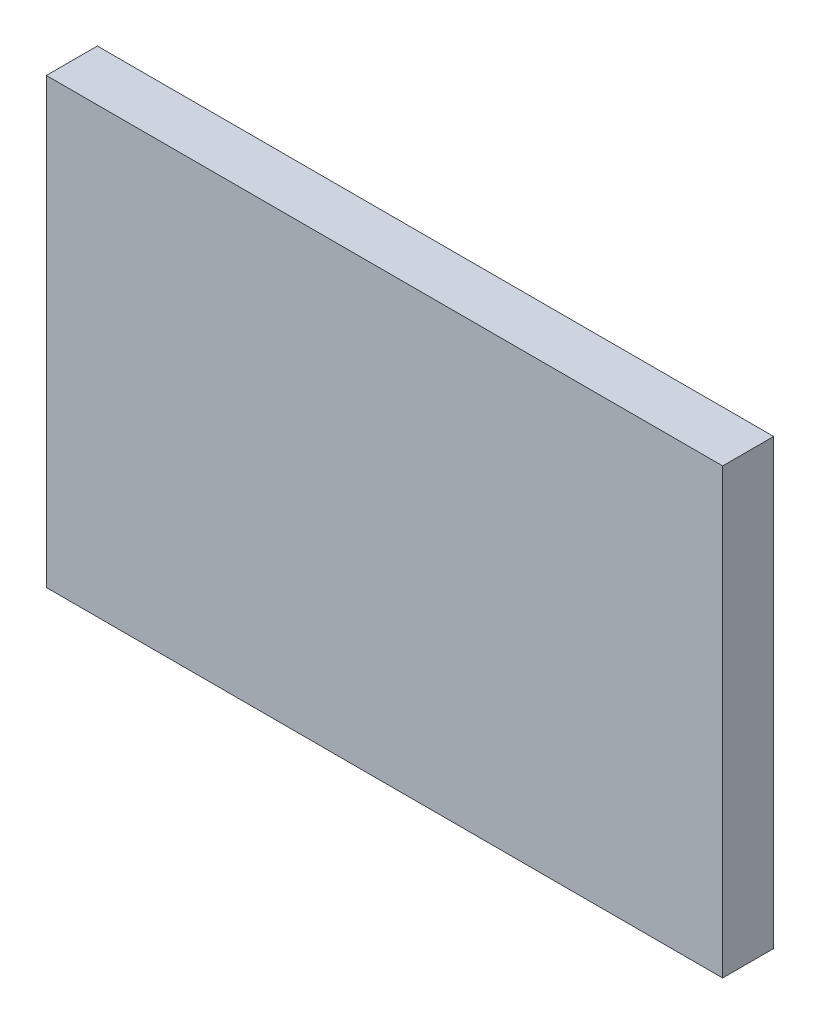
ISO-10303-21;
HEADER;
FILE_DESCRIPTION(('STEP AP214'),'2;1');
FILE_NAME('part.step','',(''),(''),'','','');
FILE_SCHEMA(('AUTOMOTIVE_DESIGN { 1 0 10303 214 1 1 1 1 }'));
ENDSEC;
DATA;
#1=APPLICATION_CONTEXT('core data for automotive mechanical design processes');
#2=APPLICATION_PROTOCOL_DEFINITION('international standard','automotive_design',2000,#1);
#3=PRODUCT_CONTEXT('',#1,'mechanical');
#4=PRODUCT('Part','Part','',(#3));
#5=PRODUCT_RELATED_PRODUCT_CATEGORY('part','',(#4));
#6=PRODUCT_DEFINITION_FORMATION('','',#4);
#7=PRODUCT_DEFINITION_CONTEXT('part definition',#1,'design');
#8=PRODUCT_DEFINITION('design','',#6,#7);
#9=PRODUCT_DEFINITION_SHAPE('','',#8);
#10=(LENGTH_UNIT() NAMED_UNIT(*) SI_UNIT(.MILLI.,.METRE.));
#11=(NAMED_UNIT(*) PLANE_ANGLE_UNIT() SI_UNIT($,.RADIAN.));
#12=(NAMED_UNIT(*) SI_UNIT($,.STERADIAN.) SOLID_ANGLE_UNIT());
#13=UNCERTAINTY_MEASURE_WITH_UNIT(LENGTH_MEASURE(1.E-05),#10,'distance_accuracy_value','');
#14=(GEOMETRIC_REPRESENTATION_CONTEXT(3) GLOBAL_UNCERTAINTY_ASSIGNED_CONTEXT((#13)) GLOBAL_UNIT_ASSIGNED_CONTEXT((#10,
#11,#12)) REPRESENTATION_CONTEXT('',''));
#15=CARTESIAN_POINT('',(0.,0.,0.));
#16=DIRECTION('',(0.,0.,1.));
#17=DIRECTION('',(1.,0.,0.));
#18=AXIS2_PLACEMENT_3D('',#15,#16,#17);
#19=CARTESIAN_POINT('',(0.,0.,-2.921));
#20=DIRECTION('',(-1.,0.,0.));
#21=DIRECTION('',(0.,0.,1.));
#22=AXIS2_PLACEMENT_3D('',#19,#20,#21);
#23=PLANE('',#22);
#24=DIRECTION('',(0.,-1.,0.));
#25=VECTOR('',#24,1.);
#26=CARTESIAN_POINT('',(0.,0.,0.));
#27=LINE('',#26,#25);
#28=CARTESIAN_POINT('',(0.,25.4,0.));
#29=VERTEX_POINT('',#28);
#30=CARTESIAN_POINT('',(0.,0.,0.));
#31=VERTEX_POINT('',#30);
#32=EDGE_CURVE('E100',#29,#31,#27,.T.);
#33=ORIENTED_EDGE('',*,*,#32,.F.);
#34=DIRECTION('',(0.,0.,1.));
#35=VECTOR('',#34,1.);
#36=CARTESIAN_POINT('',(0.,25.4,-2.921));
#37=LINE('',#36,#35);
#38=CARTESIAN_POINT('',(0.,25.4,-2.921));
#39=VERTEX_POINT('',#38);
#40=EDGE_CURVE('E11',#39,#29,#37,.T.);
#41=ORIENTED_EDGE('',*,*,#40,.F.);
#42=DIRECTION('',(0.,-1.,0.));
#43=VECTOR('',#42,1.);
#44=CARTESIAN_POINT('',(0.,0.,-2.921));
#45=LINE('',#44,#43);
#46=CARTESIAN_POINT('',(0.,0.,-2.921));
#47=VERTEX_POINT('',#46);
#48=EDGE_CURVE('E94',#39,#47,#45,.T.);
#49=ORIENTED_EDGE('',*,*,#48,.T.);
#50=DIRECTION('',(0.,0.,1.));
#51=VECTOR('',#50,1.);
#52=CARTESIAN_POINT('',(0.,0.,-2.921));
#53=LINE('',#52,#51);
#54=EDGE_CURVE('E39',#47,#31,#53,.T.);
#55=ORIENTED_EDGE('',*,*,#54,.T.);
#56=EDGE_LOOP('',(#33,#41,#49,#55));
#57=FACE_BOUND('',#56,.T.);
#58=ADVANCED_FACE('F36',(#57),#23,.T.);
#59=CARTESIAN_POINT('',(0.,25.4,-2.921));
#60=DIRECTION('',(0.,1.,0.));
#61=DIRECTION('',(0.,0.,1.));
#62=AXIS2_PLACEMENT_3D('',#59,#60,#61);
#63=PLANE('',#62);
#64=DIRECTION('',(-1.,0.,0.));
#65=VECTOR('',#64,1.);
#66=CARTESIAN_POINT('',(0.,25.4,0.));
#67=LINE('',#66,#65);
#68=CARTESIAN_POINT('',(38.735,25.4,0.));
#69=VERTEX_POINT('',#68);
#70=EDGE_CURVE('E96',#69,#29,#67,.T.);
#71=ORIENTED_EDGE('',*,*,#70,.F.);
#72=DIRECTION('',(0.,0.,1.));
#73=VECTOR('',#72,1.);
#74=CARTESIAN_POINT('',(38.735,25.4,-2.921));
#75=LINE('',#74,#73);
#76=CARTESIAN_POINT('',(38.735,25.4,-2.921));
#77=VERTEX_POINT('',#76);
#78=EDGE_CURVE('E45',#77,#69,#75,.T.);
#79=ORIENTED_EDGE('',*,*,#78,.F.);
#80=DIRECTION('',(-1.,0.,0.));
#81=VECTOR('',#80,1.);
#82=CARTESIAN_POINT('',(0.,25.4,-2.921));
#83=LINE('',#82,#81);
#84=EDGE_CURVE('E91',#77,#39,#83,.T.);
#85=ORIENTED_EDGE('',*,*,#84,.T.);
#86=ORIENTED_EDGE('',*,*,#40,.T.);
#87=EDGE_LOOP('',(#71,#79,#85,#86));
#88=FACE_BOUND('',#87,.T.);
#89=ADVANCED_FACE('F110',(#88),#63,.T.);
#90=CARTESIAN_POINT('',(38.735,0.,-2.921));
#91=DIRECTION('',(1.,0.,0.));
#92=DIRECTION('',(0.,0.,-1.));
#93=AXIS2_PLACEMENT_3D('',#90,#91,#92);
#94=PLANE('',#93);
#95=DIRECTION('',(0.,1.,0.));
#96=VECTOR('',#95,1.);
#97=CARTESIAN_POINT('',(38.735,0.,0.));
#98=LINE('',#97,#96);
#99=CARTESIAN_POINT('',(38.735,0.,0.));
#100=VERTEX_POINT('',#99);
#101=EDGE_CURVE('E86',#100,#69,#98,.T.);
#102=ORIENTED_EDGE('',*,*,#101,.F.);
#103=DIRECTION('',(0.,0.,1.));
#104=VECTOR('',#103,1.);
#105=CARTESIAN_POINT('',(38.735,0.,-2.921));
#106=LINE('',#105,#104);
#107=CARTESIAN_POINT('',(38.735,0.,-2.921));
#108=VERTEX_POINT('',#107);
#109=EDGE_CURVE('E81',#108,#100,#106,.T.);
#110=ORIENTED_EDGE('',*,*,#109,.F.);
#111=DIRECTION('',(0.,1.,0.));
#112=VECTOR('',#111,1.);
#113=CARTESIAN_POINT('',(38.735,0.,-2.921));
#114=LINE('',#113,#112);
#115=EDGE_CURVE('E84',#108,#77,#114,.T.);
#116=ORIENTED_EDGE('',*,*,#115,.T.);
#117=ORIENTED_EDGE('',*,*,#78,.T.);
#118=EDGE_LOOP('',(#102,#110,#116,#117));
#119=FACE_BOUND('',#118,.T.);
#120=ADVANCED_FACE('F83',(#119),#94,.T.);
#121=CARTESIAN_POINT('',(0.,0.,-2.921));
#122=DIRECTION('',(0.,-1.,0.));
#123=DIRECTION('',(0.,0.,-1.));
#124=AXIS2_PLACEMENT_3D('',#121,#122,#123);
#125=PLANE('',#124);
#126=DIRECTION('',(1.,0.,0.));
#127=VECTOR('',#126,1.);
#128=CARTESIAN_POINT('',(0.,0.,0.));
#129=LINE('',#128,#127);
#130=EDGE_CURVE('E103',#31,#100,#129,.T.);
#131=ORIENTED_EDGE('',*,*,#130,.F.);
#132=ORIENTED_EDGE('',*,*,#54,.F.);
#133=DIRECTION('',(1.,0.,0.));
#134=VECTOR('',#133,1.);
#135=CARTESIAN_POINT('',(0.,0.,-2.921));
#136=LINE('',#135,#134);
#137=EDGE_CURVE('E90',#47,#108,#136,.T.);
#138=ORIENTED_EDGE('',*,*,#137,.T.);
#139=ORIENTED_EDGE('',*,*,#109,.T.);
#140=EDGE_LOOP('',(#131,#132,#138,#139));
#141=FACE_BOUND('',#140,.T.);
#142=ADVANCED_FACE('F93',(#141),#125,.T.);
#143=CARTESIAN_POINT('',(0.,0.,-2.921));
#144=DIRECTION('',(0.,0.,-1.));
#145=DIRECTION('',(-1.,0.,0.));
#146=AXIS2_PLACEMENT_3D('',#143,#144,#145);
#147=PLANE('',#146);
#148=ORIENTED_EDGE('',*,*,#48,.F.);
#149=ORIENTED_EDGE('',*,*,#84,.F.);
#150=ORIENTED_EDGE('',*,*,#115,.F.);
#151=ORIENTED_EDGE('',*,*,#137,.F.);
#152=EDGE_LOOP('',(#148,#149,#150,#151));
#153=FACE_BOUND('',#152,.T.);
#154=ADVANCED_FACE('F89',(#153),#147,.T.);
#155=CARTESIAN_POINT('',(0.,0.,0.));
#156=DIRECTION('',(0.,0.,-1.));
#157=DIRECTION('',(-1.,0.,0.));
#158=AXIS2_PLACEMENT_3D('',#155,#156,#157);
#159=PLANE('',#158);
#160=ORIENTED_EDGE('',*,*,#32,.T.);
#161=ORIENTED_EDGE('',*,*,#130,.T.);
#162=ORIENTED_EDGE('',*,*,#101,.T.);
#163=ORIENTED_EDGE('',*,*,#70,.T.);
#164=EDGE_LOOP('',(#160,#161,#162,#163));
#165=FACE_BOUND('',#164,.T.);
#166=ADVANCED_FACE('F109',(#165),#159,.F.);
#167=CLOSED_SHELL('',(#58,#89,#120,#142,#154,#166));
#168=MANIFOLD_SOLID_BREP('B2',#167);
#169=ADVANCED_BREP_SHAPE_REPRESENTATION('',(#18,#168),#14);
#170=SHAPE_DEFINITION_REPRESENTATION(#9,#169);
ENDSEC;
END-ISO-10303-21;
